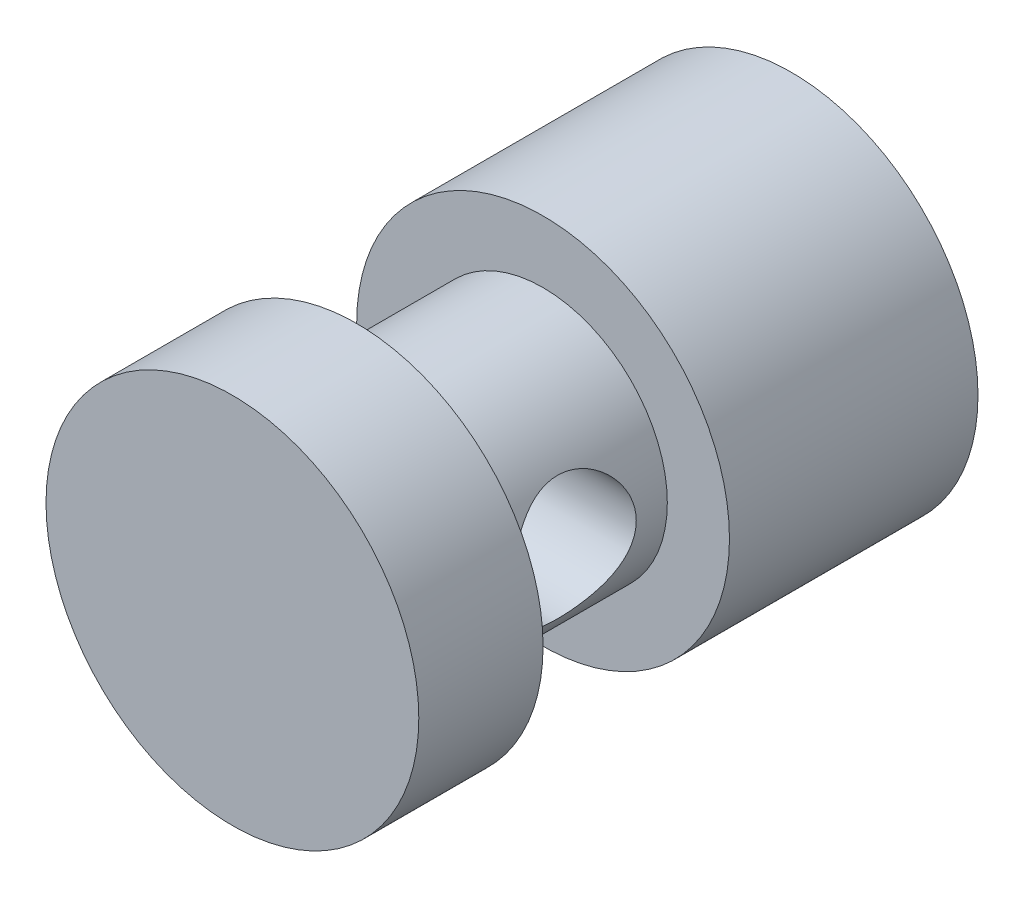
ISO-10303-21;
HEADER;
FILE_DESCRIPTION(('STEP AP214'),'2;1');
FILE_NAME('part.step','',(''),(''),'','','');
FILE_SCHEMA(('AUTOMOTIVE_DESIGN { 1 0 10303 214 1 1 1 1 }'));
ENDSEC;
DATA;
#1=APPLICATION_CONTEXT('core data for automotive mechanical design processes');
#2=APPLICATION_PROTOCOL_DEFINITION('international standard','automotive_design',2000,#1);
#3=PRODUCT_CONTEXT('',#1,'mechanical');
#4=PRODUCT('Part','Part','',(#3));
#5=PRODUCT_RELATED_PRODUCT_CATEGORY('part','',(#4));
#6=PRODUCT_DEFINITION_FORMATION('','',#4);
#7=PRODUCT_DEFINITION_CONTEXT('part definition',#1,'design');
#8=PRODUCT_DEFINITION('design','',#6,#7);
#9=PRODUCT_DEFINITION_SHAPE('','',#8);
#10=(LENGTH_UNIT() NAMED_UNIT(*) SI_UNIT(.MILLI.,.METRE.));
#11=(NAMED_UNIT(*) PLANE_ANGLE_UNIT() SI_UNIT($,.RADIAN.));
#12=(NAMED_UNIT(*) SI_UNIT($,.STERADIAN.) SOLID_ANGLE_UNIT());
#13=UNCERTAINTY_MEASURE_WITH_UNIT(LENGTH_MEASURE(1.E-05),#10,'distance_accuracy_value','');
#14=(GEOMETRIC_REPRESENTATION_CONTEXT(3) GLOBAL_UNCERTAINTY_ASSIGNED_CONTEXT((#13)) GLOBAL_UNIT_ASSIGNED_CONTEXT((#10,
#11,#12)) REPRESENTATION_CONTEXT('',''));
#15=CARTESIAN_POINT('',(0.,0.,0.));
#16=DIRECTION('',(0.,0.,1.));
#17=DIRECTION('',(1.,0.,0.));
#18=AXIS2_PLACEMENT_3D('',#15,#16,#17);
#19=CARTESIAN_POINT('',(0.,0.,4.));
#20=DIRECTION('',(0.,0.,-1.));
#21=DIRECTION('',(-1.,0.,0.));
#22=AXIS2_PLACEMENT_3D('',#19,#20,#21);
#23=CYLINDRICAL_SURFACE('',#22,3.);
#24=CARTESIAN_POINT('',(0.,0.,4.));
#25=DIRECTION('',(0.,0.,1.));
#26=DIRECTION('',(1.,0.,0.));
#27=AXIS2_PLACEMENT_3D('',#24,#25,#26);
#28=CIRCLE('',#27,3.);
#29=CARTESIAN_POINT('',(3.,0.,4.));
#30=VERTEX_POINT('',#29);
#31=EDGE_CURVE('E53',#30,#30,#28,.T.);
#32=ORIENTED_EDGE('',*,*,#31,.F.);
#33=EDGE_LOOP('',(#32));
#34=FACE_BOUND('',#33,.T.);
#35=CARTESIAN_POINT('',(0.,0.,0.));
#36=DIRECTION('',(0.,0.,1.));
#37=DIRECTION('',(1.,0.,0.));
#38=AXIS2_PLACEMENT_3D('',#35,#36,#37);
#39=CIRCLE('',#38,3.);
#40=CARTESIAN_POINT('',(3.,0.,0.));
#41=VERTEX_POINT('',#40);
#42=EDGE_CURVE('E59',#41,#41,#39,.T.);
#43=ORIENTED_EDGE('',*,*,#42,.T.);
#44=EDGE_LOOP('',(#43));
#45=FACE_BOUND('',#44,.T.);
#46=ADVANCED_FACE('F37',(#34,#45),#23,.T.);
#47=CARTESIAN_POINT('',(0.,0.,4.));
#48=DIRECTION('',(0.,0.,1.));
#49=DIRECTION('',(1.,0.,0.));
#50=AXIS2_PLACEMENT_3D('',#47,#48,#49);
#51=PLANE('',#50);
#52=CARTESIAN_POINT('',(0.,0.,4.));
#53=DIRECTION('',(0.,0.,1.));
#54=DIRECTION('',(1.,0.,0.));
#55=AXIS2_PLACEMENT_3D('',#52,#53,#54);
#56=CIRCLE('',#55,2.);
#57=CARTESIAN_POINT('',(2.,0.,4.));
#58=VERTEX_POINT('',#57);
#59=EDGE_CURVE('E49',#58,#58,#56,.T.);
#60=ORIENTED_EDGE('',*,*,#59,.F.);
#61=EDGE_LOOP('',(#60));
#62=FACE_BOUND('',#61,.T.);
#63=ORIENTED_EDGE('',*,*,#31,.T.);
#64=EDGE_LOOP('',(#63));
#65=FACE_BOUND('',#64,.T.);
#66=ADVANCED_FACE('F85',(#62,#65),#51,.T.);
#67=CARTESIAN_POINT('',(0.,0.,0.));
#68=DIRECTION('',(0.,0.,1.));
#69=DIRECTION('',(1.,0.,0.));
#70=AXIS2_PLACEMENT_3D('',#67,#68,#69);
#71=PLANE('',#70);
#72=ORIENTED_EDGE('',*,*,#42,.F.);
#73=EDGE_LOOP('',(#72));
#74=FACE_BOUND('',#73,.T.);
#75=ADVANCED_FACE('F91',(#74),#71,.F.);
#76=CARTESIAN_POINT('',(0.,0.,7.));
#77=DIRECTION('',(0.,0.,-1.));
#78=DIRECTION('',(-1.,0.,0.));
#79=AXIS2_PLACEMENT_3D('',#76,#77,#78);
#80=CYLINDRICAL_SURFACE('',#79,2.);
#81=CARTESIAN_POINT('',(-2.,0.,6.5));
#82=CARTESIAN_POINT('',(-1.99999713404151,-0.0525719629529865,6.4999966976805));
#83=CARTESIAN_POINT('',(-1.99790491019518,-0.105206599698033,6.49582992687832));
#84=CARTESIAN_POINT('',(-1.98974156037396,-0.208920235268425,6.47934711965908));
#85=CARTESIAN_POINT('',(-1.98366287828984,-0.259996086713504,6.46701560700235));
#86=CARTESIAN_POINT('',(-1.96816279403312,-0.358933544880574,6.4348061913832));
#87=CARTESIAN_POINT('',(-1.9587543917752,-0.40680680293918,6.41495761575199));
#88=CARTESIAN_POINT('',(-1.93745776515779,-0.498472616806565,6.36842937863506));
#89=CARTESIAN_POINT('',(-1.9255697363353,-0.54226549399005,6.34175025575115));
#90=CARTESIAN_POINT('',(-1.89956258258057,-0.627507817761919,6.2804827505147));
#91=CARTESIAN_POINT('',(-1.88535199127536,-0.668655211122112,6.24551352076036));
#92=CARTESIAN_POINT('',(-1.85659970246744,-0.744779444866977,6.16947852075297));
#93=CARTESIAN_POINT('',(-1.84205776209035,-0.779751583106766,6.12840814822756));
#94=CARTESIAN_POINT('',(-1.81298951197347,-0.845252000450278,6.03751665047662));
#95=CARTESIAN_POINT('',(-1.79855186970132,-0.875225335551637,5.98726390165409));
#96=CARTESIAN_POINT('',(-1.77285978772321,-0.926168226890695,5.88163266401379));
#97=CARTESIAN_POINT('',(-1.7616030760699,-0.947144214966334,5.82625787127725));
#98=CARTESIAN_POINT('',(-1.74457867037809,-0.978132442188588,5.71533489457808));
#99=CARTESIAN_POINT('',(-1.73852271583714,-0.988725857080441,5.65999554793261));
#100=CARTESIAN_POINT('',(-1.73181889948528,-1.00042699330885,5.54802116222052));
#101=CARTESIAN_POINT('',(-1.73116569343288,-1.00154408837307,5.49138745912884));
#102=CARTESIAN_POINT('',(-1.73510930257248,-0.994687287172294,5.38571397568463));
#103=CARTESIAN_POINT('',(-1.73908763662014,-0.987784559536821,5.33657596877695));
#104=CARTESIAN_POINT('',(-1.7507622873385,-0.966939849056932,5.24027809062696));
#105=CARTESIAN_POINT('',(-1.75845978831776,-0.952995623897651,5.19311885469468));
#106=CARTESIAN_POINT('',(-1.77687476412741,-0.918209780386003,5.10077086743434));
#107=CARTESIAN_POINT('',(-1.78765840663999,-0.897215067115994,5.05565360121421));
#108=CARTESIAN_POINT('',(-1.81103404281404,-0.849041687668002,4.96936570740999));
#109=CARTESIAN_POINT('',(-1.82362684780191,-0.821860243812467,4.92819686439991));
#110=CARTESIAN_POINT('',(-1.85113157903286,-0.758066054912788,4.84547874725677));
#111=CARTESIAN_POINT('',(-1.86613510236746,-0.720694458369281,4.80454312642384));
#112=CARTESIAN_POINT('',(-1.89547623300407,-0.639555578741373,4.7292645814091));
#113=CARTESIAN_POINT('',(-1.90981351958801,-0.595785256574285,4.69492480796612));
#114=CARTESIAN_POINT('',(-1.93701987282964,-0.500516505831848,4.63231433897027));
#115=CARTESIAN_POINT('',(-1.94978984162007,-0.448753591599408,4.60439952755426));
#116=CARTESIAN_POINT('',(-1.97157881121242,-0.340466215488797,4.55790297095699));
#117=CARTESIAN_POINT('',(-1.98060078943553,-0.283945576265277,4.53931381498483));
#118=CARTESIAN_POINT('',(-1.99324333741436,-0.172766491660702,4.51352459628332));
#119=CARTESIAN_POINT('',(-1.99724938301312,-0.118341530548324,4.50550876425322));
#120=CARTESIAN_POINT('',(-2.00073013459102,-0.00877959994935354,4.49853526886551));
#121=CARTESIAN_POINT('',(-2.00020698721312,0.0463570198699015,4.49957331436052));
#122=CARTESIAN_POINT('',(-1.99491192253441,0.151232971985994,4.51020668841875));
#123=CARTESIAN_POINT('',(-1.9904724568819,0.201059408049954,4.51913253273003));
#124=CARTESIAN_POINT('',(-1.97822171314819,0.298406892301917,4.54423807189509));
#125=CARTESIAN_POINT('',(-1.97041006334332,0.345927685690997,4.56041856645336));
#126=CARTESIAN_POINT('',(-1.95184251413669,0.438888608449665,4.59999846643317));
#127=CARTESIAN_POINT('',(-1.94100881769939,0.484230397006154,4.62359105011681));
#128=CARTESIAN_POINT('',(-1.91743974317109,0.570461361698921,4.67710753564604));
#129=CARTESIAN_POINT('',(-1.90470355565785,0.611348629775282,4.70703413459343));
#130=CARTESIAN_POINT('',(-1.87708221337464,0.691767689290653,4.77576042533287));
#131=CARTESIAN_POINT('',(-1.86210884848441,0.730772077824639,4.81514286845356));
#132=CARTESIAN_POINT('',(-1.83262391603874,0.80185632111324,4.8999251512693));
#133=CARTESIAN_POINT('',(-1.81811267381526,0.833931385690841,4.94532911881637));
#134=CARTESIAN_POINT('',(-1.79051192226068,0.891707914497696,5.04364365420031));
#135=CARTESIAN_POINT('',(-1.77752529663472,0.917025495878638,5.0968112662086));
#136=CARTESIAN_POINT('',(-1.75574072368126,0.958082826013803,5.20751006769252));
#137=CARTESIAN_POINT('',(-1.74693738240618,0.97383491588757,5.26503552650119));
#138=CARTESIAN_POINT('',(-1.73561501008667,0.993861687449679,5.37691022286145));
#139=CARTESIAN_POINT('',(-1.73257383460491,0.999092996400865,5.43103425342904));
#140=CARTESIAN_POINT('',(-1.73165354646175,1.00068915438079,5.53944706717073));
#141=CARTESIAN_POINT('',(-1.73377219627553,0.997057846624399,5.59373576873943));
#142=CARTESIAN_POINT('',(-1.74237862050025,0.981926125592263,5.69548350153202));
#143=CARTESIAN_POINT('',(-1.74843094482394,0.971208314342799,5.7431004701444));
#144=CARTESIAN_POINT('',(-1.76371016187918,0.943175358224645,5.83580811942471));
#145=CARTESIAN_POINT('',(-1.77293807569676,0.92585809115981,5.88089798209197));
#146=CARTESIAN_POINT('',(-1.79428530364528,0.883815745300683,5.97062485098661));
#147=CARTESIAN_POINT('',(-1.80655722396191,0.858671137816458,6.0150279018297));
#148=CARTESIAN_POINT('',(-1.8323533163459,0.802150971636634,6.09927453618059));
#149=CARTESIAN_POINT('',(-1.84587813794522,0.770772171238648,6.13911573051849));
#150=CARTESIAN_POINT('',(-1.87462323159313,0.69820332666464,6.21814198235761));
#151=CARTESIAN_POINT('',(-1.88984983311469,0.656284423010171,6.25665910236192));
#152=CARTESIAN_POINT('',(-1.91877752255088,0.566154806220279,6.32626298342363));
#153=CARTESIAN_POINT('',(-1.9324777860804,0.517940723256785,6.35734573942629));
#154=CARTESIAN_POINT('',(-1.95698009585103,0.415931596819947,6.4112363627622));
#155=CARTESIAN_POINT('',(-1.96776096562909,0.362099503934615,6.43398416941143));
#156=CARTESIAN_POINT('',(-1.98501341363465,0.250742101294191,6.46980816791895));
#157=CARTESIAN_POINT('',(-1.99149723372932,0.193227799623166,6.48291184682958));
#158=CARTESIAN_POINT('',(-1.99695461909663,0.112601946483384,6.49389741107585));
#159=CARTESIAN_POINT('',(-1.99809365339202,0.0901618794394986,6.49618264086362));
#160=CARTESIAN_POINT('',(-1.99961696977865,0.0451517318071576,6.49923466551681));
#161=CARTESIAN_POINT('',(-2.00000123103763,0.0225816476473814,6.5000014184712));
#162=CARTESIAN_POINT('',(-2.,0.,6.5));
#163=B_SPLINE_CURVE_WITH_KNOTS('',3,(#81,#82,#83,#84,#85,#86,#87,#88,#89,#90,#91,#92,#93,#94,
#95,#96,#97,#98,#99,#100,#101,#102,#103,#104,#105,#106,#107,#108,#109,#110,#111,#112,#113,#114,
#115,#116,#117,#118,#119,#120,#121,#122,#123,#124,#125,#126,#127,#128,#129,#130,#131,#132,#133,
#134,#135,#136,#137,#138,#139,#140,#141,#142,#143,#144,#145,#146,#147,#148,#149,#150,#151,#152,
#153,#154,#155,#156,#157,#158,#159,#160,#161,#162),.UNSPECIFIED.,.T.,.F.,(4,2,2,2,2,2,2,2,2,2,2,
2,2,2,2,2,2,2,2,2,2,2,2,2,2,2,2,2,2,2,2,2,2,2,2,2,2,2,2,2,4),(0.,0.157624257420293,
0.315548149709198,0.472862155492299,0.630163760581568,0.796981758718089,0.963926237654035,
1.14381726430753,1.32357947898281,1.49258012140229,1.6614135732902,1.81005712409321,
1.95874803925678,2.11090240168487,2.26312521260222,2.43464941333878,2.60625534598686,
2.78583022214441,2.96526216912279,3.12983290471346,3.29432564511476,3.44606906506122,
3.59782921630931,3.75392856027899,3.91009450748339,4.08159610644419,4.25321588615432,
4.43314682159674,4.61284511940777,4.77529307498373,4.93767059860005,5.08457930244182,
5.23153528783678,5.38836456775614,5.54527561138957,5.72125242752498,5.89732383376572,
6.07464013662925,6.2514490862493,6.31915280137697,6.38685838514846),.UNSPECIFIED.);
#164=CARTESIAN_POINT('',(-2.,0.,6.5));
#165=VERTEX_POINT('',#164);
#166=EDGE_CURVE('E40',#165,#165,#163,.T.);
#167=ORIENTED_EDGE('',*,*,#166,.T.);
#168=EDGE_LOOP('',(#167));
#169=FACE_BOUND('',#168,.T.);
#170=CARTESIAN_POINT('',(2.,0.,4.5));
#171=CARTESIAN_POINT('',(1.99999713404151,-0.0525719629529865,4.5000033023195));
#172=CARTESIAN_POINT('',(1.99790491019518,-0.105206599698033,4.50417007312167));
#173=CARTESIAN_POINT('',(1.98974156037396,-0.208920235268425,4.52065288034092));
#174=CARTESIAN_POINT('',(1.98366287828984,-0.259996086713504,4.53298439299765));
#175=CARTESIAN_POINT('',(1.96816279403312,-0.358933544880574,4.56519380861679));
#176=CARTESIAN_POINT('',(1.9587543917752,-0.40680680293918,4.58504238424801));
#177=CARTESIAN_POINT('',(1.93745776515779,-0.498472616806565,4.63157062136494));
#178=CARTESIAN_POINT('',(1.9255697363353,-0.54226549399005,4.65824974424885));
#179=CARTESIAN_POINT('',(1.89956258258057,-0.627507817761919,4.7195172494853));
#180=CARTESIAN_POINT('',(1.88535199127536,-0.668655211122112,4.75448647923964));
#181=CARTESIAN_POINT('',(1.85659970246744,-0.744779444866977,4.83052147924703));
#182=CARTESIAN_POINT('',(1.84205776209035,-0.779751583106766,4.87159185177244));
#183=CARTESIAN_POINT('',(1.81298951197347,-0.845252000450278,4.96248334952338));
#184=CARTESIAN_POINT('',(1.79855186970132,-0.875225335551637,5.01273609834591));
#185=CARTESIAN_POINT('',(1.77285978772321,-0.926168226890695,5.11836733598621));
#186=CARTESIAN_POINT('',(1.7616030760699,-0.947144214966334,5.17374212872275));
#187=CARTESIAN_POINT('',(1.74457867037809,-0.978132442188588,5.28466510542192));
#188=CARTESIAN_POINT('',(1.73852271583714,-0.988725857080441,5.34000445206739));
#189=CARTESIAN_POINT('',(1.73181889948528,-1.00042699330885,5.45197883777948));
#190=CARTESIAN_POINT('',(1.73116569343288,-1.00154408837307,5.50861254087115));
#191=CARTESIAN_POINT('',(1.73510930257248,-0.994687287172294,5.61428602431537));
#192=CARTESIAN_POINT('',(1.73908763662014,-0.987784559536821,5.66342403122305));
#193=CARTESIAN_POINT('',(1.7507622873385,-0.966939849056932,5.75972190937304));
#194=CARTESIAN_POINT('',(1.75845978831776,-0.952995623897651,5.80688114530532));
#195=CARTESIAN_POINT('',(1.77687476412741,-0.918209780386003,5.89922913256566));
#196=CARTESIAN_POINT('',(1.78765840663999,-0.897215067115994,5.94434639878579));
#197=CARTESIAN_POINT('',(1.81103404281404,-0.849041687668002,6.03063429259001));
#198=CARTESIAN_POINT('',(1.82362684780191,-0.821860243812467,6.07180313560009));
#199=CARTESIAN_POINT('',(1.85113157903286,-0.758066054912788,6.15452125274323));
#200=CARTESIAN_POINT('',(1.86613510236746,-0.720694458369281,6.19545687357616));
#201=CARTESIAN_POINT('',(1.89547623300407,-0.639555578741373,6.2707354185909));
#202=CARTESIAN_POINT('',(1.90981351958801,-0.595785256574285,6.30507519203388));
#203=CARTESIAN_POINT('',(1.93701987282964,-0.500516505831848,6.36768566102973));
#204=CARTESIAN_POINT('',(1.94978984162007,-0.448753591599408,6.39560047244574));
#205=CARTESIAN_POINT('',(1.97157881121242,-0.340466215488797,6.44209702904301));
#206=CARTESIAN_POINT('',(1.98060078943553,-0.283945576265277,6.46068618501517));
#207=CARTESIAN_POINT('',(1.99324333741436,-0.172766491660702,6.48647540371667));
#208=CARTESIAN_POINT('',(1.99724938301312,-0.118341530548324,6.49449123574678));
#209=CARTESIAN_POINT('',(2.00073013459102,-0.00877959994935354,6.50146473113449));
#210=CARTESIAN_POINT('',(2.00020698721312,0.0463570198699015,6.50042668563948));
#211=CARTESIAN_POINT('',(1.99491192253441,0.151232971985994,6.48979331158125));
#212=CARTESIAN_POINT('',(1.9904724568819,0.201059408049954,6.48086746726997));
#213=CARTESIAN_POINT('',(1.97822171314819,0.298406892301917,6.45576192810491));
#214=CARTESIAN_POINT('',(1.97041006334332,0.345927685690997,6.43958143354664));
#215=CARTESIAN_POINT('',(1.95184251413669,0.438888608449665,6.40000153356683));
#216=CARTESIAN_POINT('',(1.94100881769939,0.484230397006154,6.37640894988319));
#217=CARTESIAN_POINT('',(1.91743974317109,0.570461361698921,6.32289246435396));
#218=CARTESIAN_POINT('',(1.90470355565785,0.611348629775282,6.29296586540657));
#219=CARTESIAN_POINT('',(1.87708221337464,0.691767689290653,6.22423957466713));
#220=CARTESIAN_POINT('',(1.86210884848441,0.730772077824639,6.18485713154643));
#221=CARTESIAN_POINT('',(1.83262391603874,0.80185632111324,6.1000748487307));
#222=CARTESIAN_POINT('',(1.81811267381526,0.833931385690841,6.05467088118363));
#223=CARTESIAN_POINT('',(1.79051192226068,0.891707914497696,5.95635634579969));
#224=CARTESIAN_POINT('',(1.77752529663472,0.917025495878638,5.9031887337914));
#225=CARTESIAN_POINT('',(1.75574072368126,0.958082826013803,5.79248993230748));
#226=CARTESIAN_POINT('',(1.74693738240618,0.97383491588757,5.73496447349881));
#227=CARTESIAN_POINT('',(1.73561501008667,0.993861687449679,5.62308977713855));
#228=CARTESIAN_POINT('',(1.73257383460491,0.999092996400865,5.56896574657096));
#229=CARTESIAN_POINT('',(1.73165354646175,1.00068915438079,5.46055293282927));
#230=CARTESIAN_POINT('',(1.73377219627553,0.997057846624399,5.40626423126057));
#231=CARTESIAN_POINT('',(1.74237862050025,0.981926125592263,5.30451649846798));
#232=CARTESIAN_POINT('',(1.74843094482394,0.971208314342799,5.2568995298556));
#233=CARTESIAN_POINT('',(1.76371016187918,0.943175358224645,5.16419188057529));
#234=CARTESIAN_POINT('',(1.77293807569676,0.92585809115981,5.11910201790803));
#235=CARTESIAN_POINT('',(1.79428530364528,0.883815745300683,5.02937514901339));
#236=CARTESIAN_POINT('',(1.80655722396191,0.858671137816458,4.9849720981703));
#237=CARTESIAN_POINT('',(1.8323533163459,0.802150971636634,4.90072546381941));
#238=CARTESIAN_POINT('',(1.84587813794522,0.770772171238648,4.86088426948151));
#239=CARTESIAN_POINT('',(1.87462323159313,0.69820332666464,4.78185801764238));
#240=CARTESIAN_POINT('',(1.88984983311469,0.656284423010171,4.74334089763808));
#241=CARTESIAN_POINT('',(1.91877752255088,0.566154806220279,4.67373701657637));
#242=CARTESIAN_POINT('',(1.9324777860804,0.517940723256785,4.64265426057371));
#243=CARTESIAN_POINT('',(1.95698009585103,0.415931596819947,4.5887636372378));
#244=CARTESIAN_POINT('',(1.96776096562909,0.362099503934615,4.56601583058857));
#245=CARTESIAN_POINT('',(1.98501341363465,0.250742101294191,4.53019183208105));
#246=CARTESIAN_POINT('',(1.99149723372932,0.193227799623166,4.51708815317042));
#247=CARTESIAN_POINT('',(1.99695461909663,0.112601946483384,4.50610258892415));
#248=CARTESIAN_POINT('',(1.99809365339202,0.0901618794394986,4.50381735913638));
#249=CARTESIAN_POINT('',(1.99961696977865,0.0451517318071576,4.50076533448319));
#250=CARTESIAN_POINT('',(2.00000123103763,0.0225816476473814,4.4999985815288));
#251=CARTESIAN_POINT('',(2.,0.,4.5));
#252=B_SPLINE_CURVE_WITH_KNOTS('',3,(#170,#171,#172,#173,#174,#175,#176,#177,#178,#179,#180,
#181,#182,#183,#184,#185,#186,#187,#188,#189,#190,#191,#192,#193,#194,#195,#196,#197,#198,#199,
#200,#201,#202,#203,#204,#205,#206,#207,#208,#209,#210,#211,#212,#213,#214,#215,#216,#217,#218,
#219,#220,#221,#222,#223,#224,#225,#226,#227,#228,#229,#230,#231,#232,#233,#234,#235,#236,#237,
#238,#239,#240,#241,#242,#243,#244,#245,#246,#247,#248,#249,#250,#251),.UNSPECIFIED.,.T.,.F.,(4,
2,2,2,2,2,2,2,2,2,2,2,2,2,2,2,2,2,2,2,2,2,2,2,2,2,2,2,2,2,2,2,2,2,2,2,2,2,2,2,4),(0.,
0.157624257420293,0.315548149709198,0.472862155492299,0.630163760581568,0.796981758718089,
0.963926237654035,1.14381726430753,1.32357947898281,1.49258012140229,1.6614135732902,
1.81005712409321,1.95874803925678,2.11090240168487,2.26312521260222,2.43464941333878,
2.60625534598686,2.78583022214441,2.96526216912279,3.12983290471346,3.29432564511476,
3.44606906506122,3.59782921630931,3.75392856027899,3.91009450748339,4.08159610644419,
4.25321588615432,4.43314682159674,4.61284511940777,4.77529307498373,4.93767059860005,
5.08457930244182,5.23153528783678,5.38836456775614,5.54527561138957,5.72125242752498,
5.89732383376572,6.07464013662925,6.2514490862493,6.31915280137697,6.38685838514846),.UNSPECIFIED.);
#253=CARTESIAN_POINT('',(2.,0.,4.5));
#254=VERTEX_POINT('',#253);
#255=EDGE_CURVE('E10',#254,#254,#252,.T.);
#256=ORIENTED_EDGE('',*,*,#255,.T.);
#257=EDGE_LOOP('',(#256));
#258=FACE_BOUND('',#257,.T.);
#259=CARTESIAN_POINT('',(0.,0.,7.));
#260=DIRECTION('',(0.,0.,1.));
#261=DIRECTION('',(1.,0.,0.));
#262=AXIS2_PLACEMENT_3D('',#259,#260,#261);
#263=CIRCLE('',#262,2.);
#264=CARTESIAN_POINT('',(2.,0.,7.));
#265=VERTEX_POINT('',#264);
#266=EDGE_CURVE('E99',#265,#265,#263,.T.);
#267=ORIENTED_EDGE('',*,*,#266,.F.);
#268=EDGE_LOOP('',(#267));
#269=FACE_BOUND('',#268,.T.);
#270=ORIENTED_EDGE('',*,*,#59,.T.);
#271=EDGE_LOOP('',(#270));
#272=FACE_BOUND('',#271,.T.);
#273=ADVANCED_FACE('F61',(#169,#258,#269,#272),#80,.T.);
#274=CARTESIAN_POINT('',(-3.,0.,5.5));
#275=DIRECTION('',(1.,0.,0.));
#276=DIRECTION('',(0.,0.,-1.));
#277=AXIS2_PLACEMENT_3D('',#274,#275,#276);
#278=CYLINDRICAL_SURFACE('',#277,1.);
#279=ORIENTED_EDGE('',*,*,#166,.F.);
#280=EDGE_LOOP('',(#279));
#281=FACE_BOUND('',#280,.T.);
#282=ORIENTED_EDGE('',*,*,#255,.F.);
#283=EDGE_LOOP('',(#282));
#284=FACE_BOUND('',#283,.T.);
#285=ADVANCED_FACE('F64',(#281,#284),#278,.F.);
#286=CARTESIAN_POINT('',(0.,0.,9.));
#287=DIRECTION('',(0.,0.,-1.));
#288=DIRECTION('',(-1.,0.,0.));
#289=AXIS2_PLACEMENT_3D('',#286,#287,#288);
#290=CYLINDRICAL_SURFACE('',#289,3.);
#291=CARTESIAN_POINT('',(0.,0.,9.));
#292=DIRECTION('',(0.,0.,1.));
#293=DIRECTION('',(1.,0.,0.));
#294=AXIS2_PLACEMENT_3D('',#291,#292,#293);
#295=CIRCLE('',#294,3.);
#296=CARTESIAN_POINT('',(3.,0.,9.));
#297=VERTEX_POINT('',#296);
#298=EDGE_CURVE('E104',#297,#297,#295,.T.);
#299=ORIENTED_EDGE('',*,*,#298,.F.);
#300=EDGE_LOOP('',(#299));
#301=FACE_BOUND('',#300,.T.);
#302=CARTESIAN_POINT('',(0.,0.,7.));
#303=DIRECTION('',(0.,0.,1.));
#304=DIRECTION('',(1.,0.,0.));
#305=AXIS2_PLACEMENT_3D('',#302,#303,#304);
#306=CIRCLE('',#305,3.);
#307=CARTESIAN_POINT('',(3.,0.,7.));
#308=VERTEX_POINT('',#307);
#309=EDGE_CURVE('E106',#308,#308,#306,.T.);
#310=ORIENTED_EDGE('',*,*,#309,.T.);
#311=EDGE_LOOP('',(#310));
#312=FACE_BOUND('',#311,.T.);
#313=ADVANCED_FACE('F68',(#301,#312),#290,.T.);
#314=CARTESIAN_POINT('',(0.,0.,9.));
#315=DIRECTION('',(0.,0.,1.));
#316=DIRECTION('',(1.,0.,0.));
#317=AXIS2_PLACEMENT_3D('',#314,#315,#316);
#318=PLANE('',#317);
#319=ORIENTED_EDGE('',*,*,#298,.T.);
#320=EDGE_LOOP('',(#319));
#321=FACE_BOUND('',#320,.T.);
#322=ADVANCED_FACE('F73',(#321),#318,.T.);
#323=CARTESIAN_POINT('',(0.,0.,7.));
#324=DIRECTION('',(0.,0.,1.));
#325=DIRECTION('',(1.,0.,0.));
#326=AXIS2_PLACEMENT_3D('',#323,#324,#325);
#327=PLANE('',#326);
#328=ORIENTED_EDGE('',*,*,#266,.T.);
#329=EDGE_LOOP('',(#328));
#330=FACE_BOUND('',#329,.T.);
#331=ORIENTED_EDGE('',*,*,#309,.F.);
#332=EDGE_LOOP('',(#331));
#333=FACE_BOUND('',#332,.T.);
#334=ADVANCED_FACE('F75',(#330,#333),#327,.F.);
#335=CLOSED_SHELL('',(#46,#66,#75,#273,#285,#313,#322,#334));
#336=MANIFOLD_SOLID_BREP('B2',#335);
#337=ADVANCED_BREP_SHAPE_REPRESENTATION('',(#18,#336),#14);
#338=SHAPE_DEFINITION_REPRESENTATION(#9,#337);
ENDSEC;
END-ISO-10303-21;
